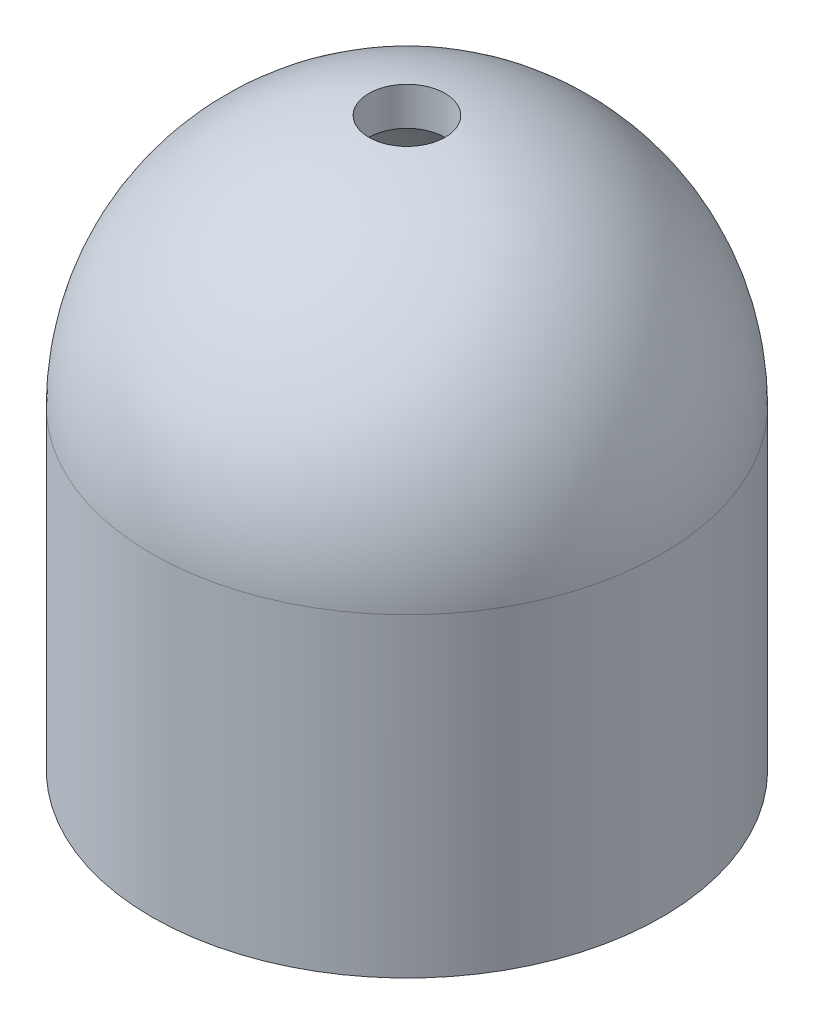
ISO-10303-21;
HEADER;
FILE_DESCRIPTION(('STEP AP214'),'2;1');
FILE_NAME('part.step','',(''),(''),'','','');
FILE_SCHEMA(('AUTOMOTIVE_DESIGN { 1 0 10303 214 1 1 1 1 }'));
ENDSEC;
DATA;
#1=APPLICATION_CONTEXT('core data for automotive mechanical design processes');
#2=APPLICATION_PROTOCOL_DEFINITION('international standard','automotive_design',2000,#1);
#3=PRODUCT_CONTEXT('',#1,'mechanical');
#4=PRODUCT('Part','Part','',(#3));
#5=PRODUCT_RELATED_PRODUCT_CATEGORY('part','',(#4));
#6=PRODUCT_DEFINITION_FORMATION('','',#4);
#7=PRODUCT_DEFINITION_CONTEXT('part definition',#1,'design');
#8=PRODUCT_DEFINITION('design','',#6,#7);
#9=PRODUCT_DEFINITION_SHAPE('','',#8);
#10=(LENGTH_UNIT() NAMED_UNIT(*) SI_UNIT(.MILLI.,.METRE.));
#11=(NAMED_UNIT(*) PLANE_ANGLE_UNIT() SI_UNIT($,.RADIAN.));
#12=(NAMED_UNIT(*) SI_UNIT($,.STERADIAN.) SOLID_ANGLE_UNIT());
#13=UNCERTAINTY_MEASURE_WITH_UNIT(LENGTH_MEASURE(1.E-05),#10,'distance_accuracy_value','');
#14=(GEOMETRIC_REPRESENTATION_CONTEXT(3) GLOBAL_UNCERTAINTY_ASSIGNED_CONTEXT((#13)) GLOBAL_UNIT_ASSIGNED_CONTEXT((#10,
#11,#12)) REPRESENTATION_CONTEXT('',''));
#15=CARTESIAN_POINT('',(0.,0.,0.));
#16=DIRECTION('',(0.,0.,1.));
#17=DIRECTION('',(1.,0.,0.));
#18=AXIS2_PLACEMENT_3D('',#15,#16,#17);
#19=CARTESIAN_POINT('',(0.,0.,0.));
#20=DIRECTION('',(0.,-1.,0.));
#21=DIRECTION('',(-1.,0.,0.));
#22=AXIS2_PLACEMENT_3D('',#19,#20,#21);
#23=SPHERICAL_SURFACE('',#22,24.0665);
#24=CARTESIAN_POINT('',(0.,0.,0.));
#25=DIRECTION('',(0.,-1.,0.));
#26=DIRECTION('',(0.,0.,-1.));
#27=AXIS2_PLACEMENT_3D('',#24,#25,#26);
#28=CIRCLE('',#27,24.0665);
#29=CARTESIAN_POINT('',(0.,0.,-24.0665));
#30=VERTEX_POINT('',#29);
#31=EDGE_CURVE('E51',#30,#30,#28,.T.);
#32=ORIENTED_EDGE('',*,*,#31,.T.);
#33=EDGE_LOOP('',(#32));
#34=FACE_BOUND('',#33,.T.);
#35=CARTESIAN_POINT('',(0.,23.6942692077641,0.));
#36=DIRECTION('',(0.,-1.,0.));
#37=DIRECTION('',(0.,0.,-1.));
#38=AXIS2_PLACEMENT_3D('',#35,#36,#37);
#39=CIRCLE('',#38,4.2164);
#40=CARTESIAN_POINT('',(0.,23.6942692077641,-4.2164));
#41=VERTEX_POINT('',#40);
#42=EDGE_CURVE('E54',#41,#41,#39,.T.);
#43=ORIENTED_EDGE('',*,*,#42,.F.);
#44=EDGE_LOOP('',(#43));
#45=FACE_BOUND('',#44,.T.);
#46=ADVANCED_FACE('F31',(#34,#45),#23,.F.);
#47=CARTESIAN_POINT('',(0.,0.,0.));
#48=DIRECTION('',(0.,-1.,0.));
#49=DIRECTION('',(-1.,0.,0.));
#50=AXIS2_PLACEMENT_3D('',#47,#48,#49);
#51=SPHERICAL_SURFACE('',#50,28.2321);
#52=CARTESIAN_POINT('',(0.,0.,0.));
#53=DIRECTION('',(0.,1.,0.));
#54=DIRECTION('',(0.,0.,1.));
#55=AXIS2_PLACEMENT_3D('',#52,#53,#54);
#56=CIRCLE('',#55,28.2321);
#57=CARTESIAN_POINT('',(0.,0.,28.2321));
#58=VERTEX_POINT('',#57);
#59=EDGE_CURVE('E39',#58,#58,#56,.T.);
#60=ORIENTED_EDGE('',*,*,#59,.T.);
#61=EDGE_LOOP('',(#60));
#62=FACE_BOUND('',#61,.T.);
#63=CARTESIAN_POINT('',(0.,27.9154695724432,0.));
#64=DIRECTION('',(0.,-1.,0.));
#65=DIRECTION('',(0.,0.,-1.));
#66=AXIS2_PLACEMENT_3D('',#63,#64,#65);
#67=CIRCLE('',#66,4.2164);
#68=CARTESIAN_POINT('',(0.,27.9154695724432,-4.2164));
#69=VERTEX_POINT('',#68);
#70=EDGE_CURVE('E35',#69,#69,#67,.F.);
#71=ORIENTED_EDGE('',*,*,#70,.F.);
#72=EDGE_LOOP('',(#71));
#73=FACE_BOUND('',#72,.T.);
#74=ADVANCED_FACE('F63',(#62,#73),#51,.T.);
#75=CARTESIAN_POINT('',(0.,-34.8234,0.));
#76=DIRECTION('',(0.,1.,0.));
#77=DIRECTION('',(0.,0.,1.));
#78=AXIS2_PLACEMENT_3D('',#75,#76,#77);
#79=CYLINDRICAL_SURFACE('',#78,28.2321);
#80=CARTESIAN_POINT('',(0.,-34.8234,0.));
#81=DIRECTION('',(0.,1.,0.));
#82=DIRECTION('',(0.,0.,1.));
#83=AXIS2_PLACEMENT_3D('',#80,#81,#82);
#84=CIRCLE('',#83,28.2321);
#85=CARTESIAN_POINT('',(0.,-34.8234,28.2321));
#86=VERTEX_POINT('',#85);
#87=EDGE_CURVE('E10',#86,#86,#84,.T.);
#88=ORIENTED_EDGE('',*,*,#87,.T.);
#89=EDGE_LOOP('',(#88));
#90=FACE_BOUND('',#89,.T.);
#91=ORIENTED_EDGE('',*,*,#59,.F.);
#92=EDGE_LOOP('',(#91));
#93=FACE_BOUND('',#92,.T.);
#94=ADVANCED_FACE('F33',(#90,#93),#79,.T.);
#95=CARTESIAN_POINT('',(0.,-34.8234,0.));
#96=DIRECTION('',(0.,1.,0.));
#97=DIRECTION('',(0.,0.,1.));
#98=AXIS2_PLACEMENT_3D('',#95,#96,#97);
#99=PLANE('',#98);
#100=CARTESIAN_POINT('',(0.,-34.8234,0.));
#101=DIRECTION('',(0.,1.,0.));
#102=DIRECTION('',(0.,0.,1.));
#103=AXIS2_PLACEMENT_3D('',#100,#101,#102);
#104=CIRCLE('',#103,24.1046);
#105=CARTESIAN_POINT('',(0.,-34.8234,24.1046));
#106=VERTEX_POINT('',#105);
#107=EDGE_CURVE('E44',#106,#106,#104,.T.);
#108=ORIENTED_EDGE('',*,*,#107,.T.);
#109=EDGE_LOOP('',(#108));
#110=FACE_BOUND('',#109,.T.);
#111=ORIENTED_EDGE('',*,*,#87,.F.);
#112=EDGE_LOOP('',(#111));
#113=FACE_BOUND('',#112,.T.);
#114=ADVANCED_FACE('F71',(#110,#113),#99,.F.);
#115=CARTESIAN_POINT('',(0.,-34.8234,0.));
#116=DIRECTION('',(0.,1.,0.));
#117=DIRECTION('',(0.,0.,1.));
#118=AXIS2_PLACEMENT_3D('',#115,#116,#117);
#119=CYLINDRICAL_SURFACE('',#118,24.1046);
#120=ORIENTED_EDGE('',*,*,#107,.F.);
#121=EDGE_LOOP('',(#120));
#122=FACE_BOUND('',#121,.T.);
#123=CARTESIAN_POINT('',(0.,0.,0.));
#124=DIRECTION('',(0.,1.,0.));
#125=DIRECTION('',(0.,0.,1.));
#126=AXIS2_PLACEMENT_3D('',#123,#124,#125);
#127=CIRCLE('',#126,24.1046);
#128=CARTESIAN_POINT('',(0.,0.,24.1046));
#129=VERTEX_POINT('',#128);
#130=EDGE_CURVE('E48',#129,#129,#127,.F.);
#131=ORIENTED_EDGE('',*,*,#130,.F.);
#132=EDGE_LOOP('',(#131));
#133=FACE_BOUND('',#132,.T.);
#134=ADVANCED_FACE('F77',(#122,#133),#119,.F.);
#135=CARTESIAN_POINT('',(-28.2321,0.,0.));
#136=DIRECTION('',(0.,1.,0.));
#137=DIRECTION('',(0.,0.,1.));
#138=AXIS2_PLACEMENT_3D('',#135,#136,#137);
#139=PLANE('',#138);
#140=ORIENTED_EDGE('',*,*,#31,.F.);
#141=EDGE_LOOP('',(#140));
#142=FACE_BOUND('',#141,.T.);
#143=ORIENTED_EDGE('',*,*,#130,.T.);
#144=EDGE_LOOP('',(#143));
#145=FACE_BOUND('',#144,.T.);
#146=ADVANCED_FACE('F76',(#142,#145),#139,.F.);
#147=CARTESIAN_POINT('',(0.,34.8234,0.));
#148=DIRECTION('',(0.,-1.,0.));
#149=DIRECTION('',(0.,0.,-1.));
#150=AXIS2_PLACEMENT_3D('',#147,#148,#149);
#151=CYLINDRICAL_SURFACE('',#150,4.2164);
#152=ORIENTED_EDGE('',*,*,#70,.T.);
#153=EDGE_LOOP('',(#152));
#154=FACE_BOUND('',#153,.T.);
#155=ORIENTED_EDGE('',*,*,#42,.T.);
#156=EDGE_LOOP('',(#155));
#157=FACE_BOUND('',#156,.T.);
#158=ADVANCED_FACE('F61',(#154,#157),#151,.F.);
#159=CLOSED_SHELL('',(#46,#74,#94,#114,#134,#146,#158));
#160=MANIFOLD_SOLID_BREP('B2',#159);
#161=ADVANCED_BREP_SHAPE_REPRESENTATION('',(#18,#160),#14);
#162=SHAPE_DEFINITION_REPRESENTATION(#9,#161);
ENDSEC;
END-ISO-10303-21;
